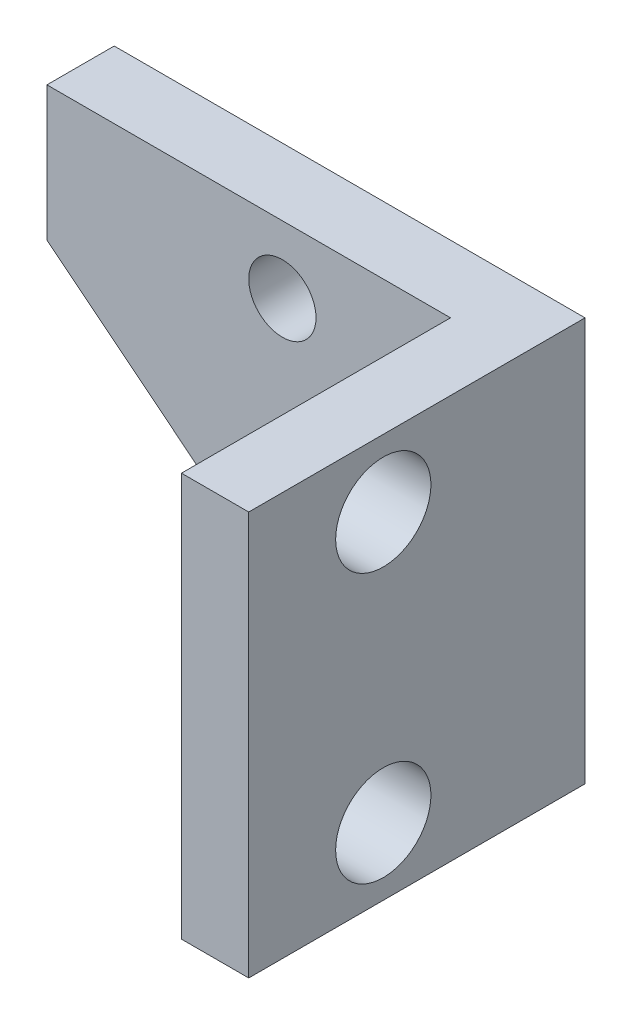
ISO-10303-21;
HEADER;
FILE_DESCRIPTION(('STEP AP214'),'2;1');
FILE_NAME('part.step','',(''),(''),'','','');
FILE_SCHEMA(('AUTOMOTIVE_DESIGN { 1 0 10303 214 1 1 1 1 }'));
ENDSEC;
DATA;
#1=APPLICATION_CONTEXT('core data for automotive mechanical design processes');
#2=APPLICATION_PROTOCOL_DEFINITION('international standard','automotive_design',2000,#1);
#3=PRODUCT_CONTEXT('',#1,'mechanical');
#4=PRODUCT('Part','Part','',(#3));
#5=PRODUCT_RELATED_PRODUCT_CATEGORY('part','',(#4));
#6=PRODUCT_DEFINITION_FORMATION('','',#4);
#7=PRODUCT_DEFINITION_CONTEXT('part definition',#1,'design');
#8=PRODUCT_DEFINITION('design','',#6,#7);
#9=PRODUCT_DEFINITION_SHAPE('','',#8);
#10=(LENGTH_UNIT() NAMED_UNIT(*) SI_UNIT(.MILLI.,.METRE.));
#11=(NAMED_UNIT(*) PLANE_ANGLE_UNIT() SI_UNIT($,.RADIAN.));
#12=(NAMED_UNIT(*) SI_UNIT($,.STERADIAN.) SOLID_ANGLE_UNIT());
#13=UNCERTAINTY_MEASURE_WITH_UNIT(LENGTH_MEASURE(1.E-05),#10,'distance_accuracy_value','');
#14=(GEOMETRIC_REPRESENTATION_CONTEXT(3) GLOBAL_UNCERTAINTY_ASSIGNED_CONTEXT((#13)) GLOBAL_UNIT_ASSIGNED_CONTEXT((#10,
#11,#12)) REPRESENTATION_CONTEXT('',''));
#15=CARTESIAN_POINT('',(0.,0.,0.));
#16=DIRECTION('',(0.,0.,1.));
#17=DIRECTION('',(1.,0.,0.));
#18=AXIS2_PLACEMENT_3D('',#15,#16,#17);
#19=CARTESIAN_POINT('',(0.,0.,3.175));
#20=DIRECTION('',(0.,0.,1.));
#21=DIRECTION('',(1.,0.,0.));
#22=AXIS2_PLACEMENT_3D('',#19,#20,#21);
#23=PLANE('',#22);
#24=CARTESIAN_POINT('',(-11.1125,-3.175,3.175));
#25=DIRECTION('',(0.,0.,1.));
#26=DIRECTION('',(1.,0.,0.));
#27=AXIS2_PLACEMENT_3D('',#24,#25,#26);
#28=CIRCLE('',#27,1.58749999999999);
#29=CARTESIAN_POINT('',(-9.52500000000001,-3.175,3.175));
#30=VERTEX_POINT('',#29);
#31=EDGE_CURVE('E138',#30,#30,#28,.T.);
#32=ORIENTED_EDGE('',*,*,#31,.F.);
#33=EDGE_LOOP('',(#32));
#34=FACE_BOUND('',#33,.T.);
#35=DIRECTION('',(1.,0.,0.));
#36=VECTOR('',#35,1.);
#37=CARTESIAN_POINT('',(-6.35,-19.05,3.175));
#38=LINE('',#37,#36);
#39=CARTESIAN_POINT('',(-6.35,-19.05,3.175));
#40=VERTEX_POINT('',#39);
#41=CARTESIAN_POINT('',(-3.175,-19.05,3.175));
#42=VERTEX_POINT('',#41);
#43=EDGE_CURVE('E54',#40,#42,#38,.T.);
#44=ORIENTED_EDGE('',*,*,#43,.T.);
#45=DIRECTION('',(0.,1.,0.));
#46=VECTOR('',#45,1.);
#47=CARTESIAN_POINT('',(-3.175,0.,3.175));
#48=LINE('',#47,#46);
#49=CARTESIAN_POINT('',(-3.175,0.,3.175));
#50=VERTEX_POINT('',#49);
#51=EDGE_CURVE('E58',#42,#50,#48,.T.);
#52=ORIENTED_EDGE('',*,*,#51,.T.);
#53=DIRECTION('',(-1.,0.,0.));
#54=VECTOR('',#53,1.);
#55=CARTESIAN_POINT('',(0.,0.,3.175));
#56=LINE('',#55,#54);
#57=CARTESIAN_POINT('',(-22.225,0.,3.175));
#58=VERTEX_POINT('',#57);
#59=EDGE_CURVE('E146',#50,#58,#56,.T.);
#60=ORIENTED_EDGE('',*,*,#59,.T.);
#61=DIRECTION('',(0.,-1.,0.));
#62=VECTOR('',#61,1.);
#63=CARTESIAN_POINT('',(-22.225,0.,3.175));
#64=LINE('',#63,#62);
#65=CARTESIAN_POINT('',(-22.225,-6.35,3.175));
#66=VERTEX_POINT('',#65);
#67=EDGE_CURVE('E149',#58,#66,#64,.T.);
#68=ORIENTED_EDGE('',*,*,#67,.T.);
#69=DIRECTION('',(0.78086880944303,-0.624695047554424,0.));
#70=VECTOR('',#69,1.);
#71=CARTESIAN_POINT('',(-22.225,-6.35,3.175));
#72=LINE('',#71,#70);
#73=EDGE_CURVE('E153',#66,#40,#72,.T.);
#74=ORIENTED_EDGE('',*,*,#73,.T.);
#75=EDGE_LOOP('',(#44,#52,#60,#68,#74));
#76=FACE_BOUND('',#75,.T.);
#77=ADVANCED_FACE('F38',(#34,#76),#23,.T.);
#78=CARTESIAN_POINT('',(0.,-19.05,3.175));
#79=DIRECTION('',(-1.,0.,0.));
#80=DIRECTION('',(0.,0.,1.));
#81=AXIS2_PLACEMENT_3D('',#78,#79,#80);
#82=PLANE('',#81);
#83=CARTESIAN_POINT('',(0.,-3.175,9.525));
#84=DIRECTION('',(-1.,0.,0.));
#85=DIRECTION('',(0.,0.,1.));
#86=AXIS2_PLACEMENT_3D('',#83,#84,#85);
#87=CIRCLE('',#86,2.2479);
#88=CARTESIAN_POINT('',(0.,-3.175,11.7729));
#89=VERTEX_POINT('',#88);
#90=EDGE_CURVE('E293',#89,#89,#87,.T.);
#91=ORIENTED_EDGE('',*,*,#90,.T.);
#92=EDGE_LOOP('',(#91));
#93=FACE_BOUND('',#92,.T.);
#94=CARTESIAN_POINT('',(0.,-15.875,9.525));
#95=DIRECTION('',(-1.,0.,0.));
#96=DIRECTION('',(0.,0.,1.));
#97=AXIS2_PLACEMENT_3D('',#94,#95,#96);
#98=CIRCLE('',#97,2.2479);
#99=CARTESIAN_POINT('',(0.,-15.875,11.7729));
#100=VERTEX_POINT('',#99);
#101=EDGE_CURVE('E118',#100,#100,#98,.T.);
#102=ORIENTED_EDGE('',*,*,#101,.T.);
#103=EDGE_LOOP('',(#102));
#104=FACE_BOUND('',#103,.T.);
#105=DIRECTION('',(0.,1.,0.));
#106=VECTOR('',#105,1.);
#107=CARTESIAN_POINT('',(0.,-19.05,0.));
#108=LINE('',#107,#106);
#109=CARTESIAN_POINT('',(0.,-19.05,0.));
#110=VERTEX_POINT('',#109);
#111=CARTESIAN_POINT('',(0.,0.,0.));
#112=VERTEX_POINT('',#111);
#113=EDGE_CURVE('E101',#110,#112,#108,.T.);
#114=ORIENTED_EDGE('',*,*,#113,.T.);
#115=DIRECTION('',(0.,0.,-1.));
#116=VECTOR('',#115,1.);
#117=CARTESIAN_POINT('',(0.,0.,3.175));
#118=LINE('',#117,#116);
#119=CARTESIAN_POINT('',(0.,0.,15.875));
#120=VERTEX_POINT('',#119);
#121=EDGE_CURVE('E11',#120,#112,#118,.T.);
#122=ORIENTED_EDGE('',*,*,#121,.F.);
#123=DIRECTION('',(0.,1.,0.));
#124=VECTOR('',#123,1.);
#125=CARTESIAN_POINT('',(0.,0.,15.875));
#126=LINE('',#125,#124);
#127=CARTESIAN_POINT('',(0.,-19.05,15.875));
#128=VERTEX_POINT('',#127);
#129=EDGE_CURVE('E99',#128,#120,#126,.T.);
#130=ORIENTED_EDGE('',*,*,#129,.F.);
#131=DIRECTION('',(0.,0.,-1.));
#132=VECTOR('',#131,1.);
#133=CARTESIAN_POINT('',(0.,-19.05,3.175));
#134=LINE('',#133,#132);
#135=EDGE_CURVE('E158',#128,#110,#134,.T.);
#136=ORIENTED_EDGE('',*,*,#135,.T.);
#137=EDGE_LOOP('',(#114,#122,#130,#136));
#138=FACE_BOUND('',#137,.T.);
#139=ADVANCED_FACE('F40',(#93,#104,#138),#82,.F.);
#140=CARTESIAN_POINT('',(0.,0.,3.175));
#141=DIRECTION('',(0.,-1.,0.));
#142=DIRECTION('',(1.,0.,0.));
#143=AXIS2_PLACEMENT_3D('',#140,#141,#142);
#144=PLANE('',#143);
#145=DIRECTION('',(-1.,0.,0.));
#146=VECTOR('',#145,1.);
#147=CARTESIAN_POINT('',(0.,0.,0.));
#148=LINE('',#147,#146);
#149=CARTESIAN_POINT('',(-22.225,0.,0.));
#150=VERTEX_POINT('',#149);
#151=EDGE_CURVE('E161',#112,#150,#148,.T.);
#152=ORIENTED_EDGE('',*,*,#151,.T.);
#153=DIRECTION('',(0.,0.,-1.));
#154=VECTOR('',#153,1.);
#155=CARTESIAN_POINT('',(-22.225,0.,3.175));
#156=LINE('',#155,#154);
#157=EDGE_CURVE('E47',#58,#150,#156,.T.);
#158=ORIENTED_EDGE('',*,*,#157,.F.);
#159=ORIENTED_EDGE('',*,*,#59,.F.);
#160=DIRECTION('',(0.,0.,-1.));
#161=VECTOR('',#160,1.);
#162=CARTESIAN_POINT('',(-3.175,0.,15.875));
#163=LINE('',#162,#161);
#164=CARTESIAN_POINT('',(-3.175,0.,15.875));
#165=VERTEX_POINT('',#164);
#166=EDGE_CURVE('E107',#165,#50,#163,.T.);
#167=ORIENTED_EDGE('',*,*,#166,.F.);
#168=DIRECTION('',(-1.,0.,0.));
#169=VECTOR('',#168,1.);
#170=CARTESIAN_POINT('',(0.,0.,15.875));
#171=LINE('',#170,#169);
#172=EDGE_CURVE('E104',#120,#165,#171,.T.);
#173=ORIENTED_EDGE('',*,*,#172,.F.);
#174=ORIENTED_EDGE('',*,*,#121,.T.);
#175=EDGE_LOOP('',(#152,#158,#159,#167,#173,#174));
#176=FACE_BOUND('',#175,.T.);
#177=ADVANCED_FACE('F105',(#176),#144,.F.);
#178=CARTESIAN_POINT('',(-22.225,0.,3.175));
#179=DIRECTION('',(1.,0.,0.));
#180=DIRECTION('',(0.,0.,-1.));
#181=AXIS2_PLACEMENT_3D('',#178,#179,#180);
#182=PLANE('',#181);
#183=DIRECTION('',(0.,-1.,0.));
#184=VECTOR('',#183,1.);
#185=CARTESIAN_POINT('',(-22.225,0.,0.));
#186=LINE('',#185,#184);
#187=CARTESIAN_POINT('',(-22.225,-6.35,0.));
#188=VERTEX_POINT('',#187);
#189=EDGE_CURVE('E164',#150,#188,#186,.T.);
#190=ORIENTED_EDGE('',*,*,#189,.T.);
#191=DIRECTION('',(0.,0.,-1.));
#192=VECTOR('',#191,1.);
#193=CARTESIAN_POINT('',(-22.225,-6.35,3.175));
#194=LINE('',#193,#192);
#195=EDGE_CURVE('E178',#66,#188,#194,.T.);
#196=ORIENTED_EDGE('',*,*,#195,.F.);
#197=ORIENTED_EDGE('',*,*,#67,.F.);
#198=ORIENTED_EDGE('',*,*,#157,.T.);
#199=EDGE_LOOP('',(#190,#196,#197,#198));
#200=FACE_BOUND('',#199,.T.);
#201=ADVANCED_FACE('F187',(#200),#182,.F.);
#202=CARTESIAN_POINT('',(-22.225,-6.35,3.175));
#203=DIRECTION('',(0.624695047554424,0.78086880944303,0.));
#204=DIRECTION('',(-0.78086880944303,0.624695047554424,0.));
#205=AXIS2_PLACEMENT_3D('',#202,#203,#204);
#206=PLANE('',#205);
#207=DIRECTION('',(0.78086880944303,-0.624695047554424,0.));
#208=VECTOR('',#207,1.);
#209=CARTESIAN_POINT('',(-22.225,-6.35,0.));
#210=LINE('',#209,#208);
#211=CARTESIAN_POINT('',(-6.35,-19.05,0.));
#212=VERTEX_POINT('',#211);
#213=EDGE_CURVE('E167',#188,#212,#210,.T.);
#214=ORIENTED_EDGE('',*,*,#213,.T.);
#215=DIRECTION('',(0.,0.,-1.));
#216=VECTOR('',#215,1.);
#217=CARTESIAN_POINT('',(-6.35,-19.05,3.175));
#218=LINE('',#217,#216);
#219=EDGE_CURVE('E174',#40,#212,#218,.T.);
#220=ORIENTED_EDGE('',*,*,#219,.F.);
#221=ORIENTED_EDGE('',*,*,#73,.F.);
#222=ORIENTED_EDGE('',*,*,#195,.T.);
#223=EDGE_LOOP('',(#214,#220,#221,#222));
#224=FACE_BOUND('',#223,.T.);
#225=ADVANCED_FACE('F196',(#224),#206,.F.);
#226=CARTESIAN_POINT('',(-6.35,-19.05,3.175));
#227=DIRECTION('',(0.,1.,0.));
#228=DIRECTION('',(0.,0.,1.));
#229=AXIS2_PLACEMENT_3D('',#226,#227,#228);
#230=PLANE('',#229);
#231=ORIENTED_EDGE('',*,*,#135,.F.);
#232=DIRECTION('',(1.,0.,0.));
#233=VECTOR('',#232,1.);
#234=CARTESIAN_POINT('',(0.,-19.05,15.875));
#235=LINE('',#234,#233);
#236=CARTESIAN_POINT('',(-3.175,-19.05,15.875));
#237=VERTEX_POINT('',#236);
#238=EDGE_CURVE('E116',#237,#128,#235,.T.);
#239=ORIENTED_EDGE('',*,*,#238,.F.);
#240=DIRECTION('',(0.,0.,-1.));
#241=VECTOR('',#240,1.);
#242=CARTESIAN_POINT('',(-3.175,-19.05,15.875));
#243=LINE('',#242,#241);
#244=EDGE_CURVE('E130',#237,#42,#243,.T.);
#245=ORIENTED_EDGE('',*,*,#244,.T.);
#246=ORIENTED_EDGE('',*,*,#43,.F.);
#247=ORIENTED_EDGE('',*,*,#219,.T.);
#248=DIRECTION('',(1.,0.,0.));
#249=VECTOR('',#248,1.);
#250=CARTESIAN_POINT('',(-6.35,-19.05,0.));
#251=LINE('',#250,#249);
#252=EDGE_CURVE('E150',#212,#110,#251,.T.);
#253=ORIENTED_EDGE('',*,*,#252,.T.);
#254=EDGE_LOOP('',(#231,#239,#245,#246,#247,#253));
#255=FACE_BOUND('',#254,.T.);
#256=ADVANCED_FACE('F199',(#255),#230,.F.);
#257=CARTESIAN_POINT('',(0.,0.,0.));
#258=DIRECTION('',(0.,0.,1.));
#259=DIRECTION('',(1.,0.,0.));
#260=AXIS2_PLACEMENT_3D('',#257,#258,#259);
#261=PLANE('',#260);
#262=ORIENTED_EDGE('',*,*,#113,.F.);
#263=ORIENTED_EDGE('',*,*,#252,.F.);
#264=ORIENTED_EDGE('',*,*,#213,.F.);
#265=ORIENTED_EDGE('',*,*,#189,.F.);
#266=ORIENTED_EDGE('',*,*,#151,.F.);
#267=EDGE_LOOP('',(#262,#263,#264,#265,#266));
#268=FACE_BOUND('',#267,.T.);
#269=CARTESIAN_POINT('',(-11.1125,-3.175,0.));
#270=DIRECTION('',(0.,0.,1.));
#271=DIRECTION('',(1.,0.,0.));
#272=AXIS2_PLACEMENT_3D('',#269,#270,#271);
#273=CIRCLE('',#272,1.5875);
#274=CARTESIAN_POINT('',(-9.525,-3.175,0.));
#275=VERTEX_POINT('',#274);
#276=EDGE_CURVE('E142',#275,#275,#273,.T.);
#277=ORIENTED_EDGE('',*,*,#276,.T.);
#278=EDGE_LOOP('',(#277));
#279=FACE_BOUND('',#278,.T.);
#280=ADVANCED_FACE('F191',(#268,#279),#261,.F.);
#281=CARTESIAN_POINT('',(-11.1125,-3.175,3.175));
#282=DIRECTION('',(0.,0.,1.));
#283=DIRECTION('',(1.,0.,0.));
#284=AXIS2_PLACEMENT_3D('',#281,#282,#283);
#285=CYLINDRICAL_SURFACE('',#284,1.58749999999999);
#286=ORIENTED_EDGE('',*,*,#276,.F.);
#287=EDGE_LOOP('',(#286));
#288=FACE_BOUND('',#287,.T.);
#289=ORIENTED_EDGE('',*,*,#31,.T.);
#290=EDGE_LOOP('',(#289));
#291=FACE_BOUND('',#290,.T.);
#292=ADVANCED_FACE('F204',(#288,#291),#285,.F.);
#293=CARTESIAN_POINT('',(-3.175,0.,15.875));
#294=DIRECTION('',(1.,0.,0.));
#295=DIRECTION('',(0.,0.,-1.));
#296=AXIS2_PLACEMENT_3D('',#293,#294,#295);
#297=PLANE('',#296);
#298=CARTESIAN_POINT('',(-3.175,-3.175,9.525));
#299=DIRECTION('',(-1.,0.,0.));
#300=DIRECTION('',(0.,0.,1.));
#301=AXIS2_PLACEMENT_3D('',#298,#299,#300);
#302=CIRCLE('',#301,2.2479);
#303=CARTESIAN_POINT('',(-3.175,-3.175,11.7729));
#304=VERTEX_POINT('',#303);
#305=EDGE_CURVE('E295',#304,#304,#302,.T.);
#306=ORIENTED_EDGE('',*,*,#305,.F.);
#307=EDGE_LOOP('',(#306));
#308=FACE_BOUND('',#307,.T.);
#309=CARTESIAN_POINT('',(-3.175,-15.875,9.525));
#310=DIRECTION('',(-1.,0.,0.));
#311=DIRECTION('',(0.,0.,1.));
#312=AXIS2_PLACEMENT_3D('',#309,#310,#311);
#313=CIRCLE('',#312,2.2479);
#314=CARTESIAN_POINT('',(-3.175,-15.875,11.7729));
#315=VERTEX_POINT('',#314);
#316=EDGE_CURVE('E122',#315,#315,#313,.T.);
#317=ORIENTED_EDGE('',*,*,#316,.F.);
#318=EDGE_LOOP('',(#317));
#319=FACE_BOUND('',#318,.T.);
#320=ORIENTED_EDGE('',*,*,#51,.F.);
#321=ORIENTED_EDGE('',*,*,#244,.F.);
#322=DIRECTION('',(0.,-1.,0.));
#323=VECTOR('',#322,1.);
#324=CARTESIAN_POINT('',(-3.175,0.,15.875));
#325=LINE('',#324,#323);
#326=EDGE_CURVE('E111',#165,#237,#325,.T.);
#327=ORIENTED_EDGE('',*,*,#326,.F.);
#328=ORIENTED_EDGE('',*,*,#166,.T.);
#329=EDGE_LOOP('',(#320,#321,#327,#328));
#330=FACE_BOUND('',#329,.T.);
#331=ADVANCED_FACE('F202',(#308,#319,#330),#297,.F.);
#332=CARTESIAN_POINT('',(0.,0.,15.875));
#333=DIRECTION('',(0.,0.,1.));
#334=DIRECTION('',(1.,0.,0.));
#335=AXIS2_PLACEMENT_3D('',#332,#333,#334);
#336=PLANE('',#335);
#337=ORIENTED_EDGE('',*,*,#129,.T.);
#338=ORIENTED_EDGE('',*,*,#172,.T.);
#339=ORIENTED_EDGE('',*,*,#326,.T.);
#340=ORIENTED_EDGE('',*,*,#238,.T.);
#341=EDGE_LOOP('',(#337,#338,#339,#340));
#342=FACE_BOUND('',#341,.T.);
#343=ADVANCED_FACE('F114',(#342),#336,.T.);
#344=CARTESIAN_POINT('',(-3.175,-15.875,9.525));
#345=DIRECTION('',(-1.,0.,0.));
#346=DIRECTION('',(0.,0.,1.));
#347=AXIS2_PLACEMENT_3D('',#344,#345,#346);
#348=CYLINDRICAL_SURFACE('',#347,2.2479);
#349=ORIENTED_EDGE('',*,*,#101,.F.);
#350=EDGE_LOOP('',(#349));
#351=FACE_BOUND('',#350,.T.);
#352=ORIENTED_EDGE('',*,*,#316,.T.);
#353=EDGE_LOOP('',(#352));
#354=FACE_BOUND('',#353,.T.);
#355=ADVANCED_FACE('F212',(#351,#354),#348,.F.);
#356=CARTESIAN_POINT('',(-3.175,-3.175,9.525));
#357=DIRECTION('',(-1.,0.,0.));
#358=DIRECTION('',(0.,0.,1.));
#359=AXIS2_PLACEMENT_3D('',#356,#357,#358);
#360=CYLINDRICAL_SURFACE('',#359,2.2479);
#361=ORIENTED_EDGE('',*,*,#90,.F.);
#362=EDGE_LOOP('',(#361));
#363=FACE_BOUND('',#362,.T.);
#364=ORIENTED_EDGE('',*,*,#305,.T.);
#365=EDGE_LOOP('',(#364));
#366=FACE_BOUND('',#365,.T.);
#367=ADVANCED_FACE('F273',(#363,#366),#360,.F.);
#368=CLOSED_SHELL('',(#77,#139,#177,#201,#225,#256,#280,#292,#331,#343,#355,#367));
#369=MANIFOLD_SOLID_BREP('B2',#368);
#370=ADVANCED_BREP_SHAPE_REPRESENTATION('',(#18,#369),#14);
#371=SHAPE_DEFINITION_REPRESENTATION(#9,#370);
ENDSEC;
END-ISO-10303-21;
